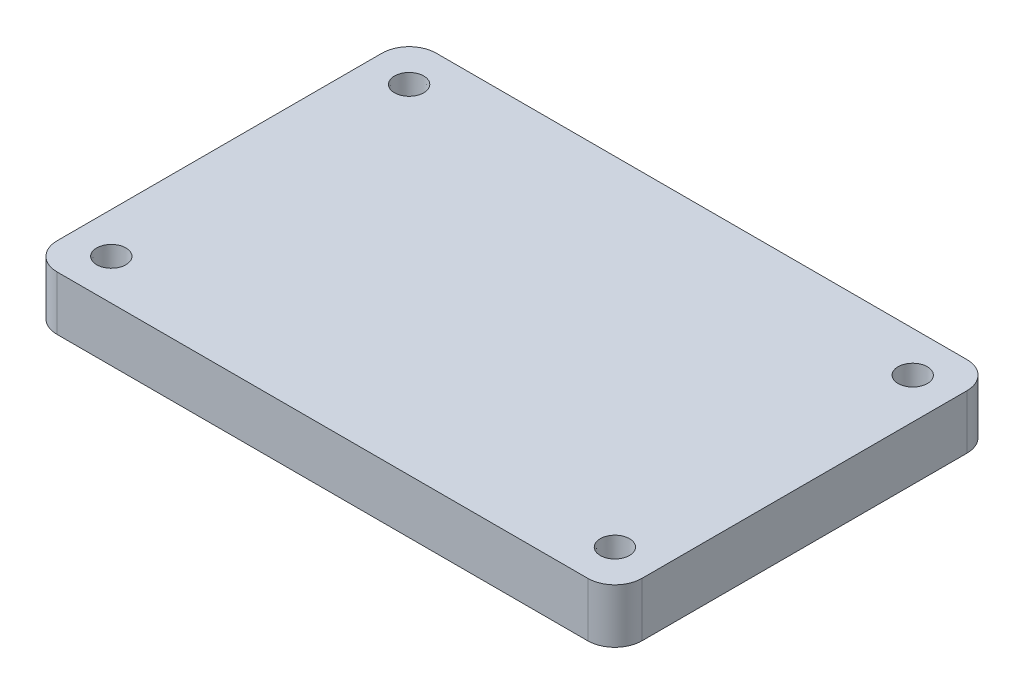
ISO-10303-21;
HEADER;
FILE_DESCRIPTION(('STEP AP214'),'2;1');
FILE_NAME('part.step','',(''),(''),'','','');
FILE_SCHEMA(('AUTOMOTIVE_DESIGN { 1 0 10303 214 1 1 1 1 }'));
ENDSEC;
DATA;
#1=APPLICATION_CONTEXT('core data for automotive mechanical design processes');
#2=APPLICATION_PROTOCOL_DEFINITION('international standard','automotive_design',2000,#1);
#3=PRODUCT_CONTEXT('',#1,'mechanical');
#4=PRODUCT('Part','Part','',(#3));
#5=PRODUCT_RELATED_PRODUCT_CATEGORY('part','',(#4));
#6=PRODUCT_DEFINITION_FORMATION('','',#4);
#7=PRODUCT_DEFINITION_CONTEXT('part definition',#1,'design');
#8=PRODUCT_DEFINITION('design','',#6,#7);
#9=PRODUCT_DEFINITION_SHAPE('','',#8);
#10=(LENGTH_UNIT() NAMED_UNIT(*) SI_UNIT(.MILLI.,.METRE.));
#11=(NAMED_UNIT(*) PLANE_ANGLE_UNIT() SI_UNIT($,.RADIAN.));
#12=(NAMED_UNIT(*) SI_UNIT($,.STERADIAN.) SOLID_ANGLE_UNIT());
#13=UNCERTAINTY_MEASURE_WITH_UNIT(LENGTH_MEASURE(1.E-05),#10,'distance_accuracy_value','');
#14=(GEOMETRIC_REPRESENTATION_CONTEXT(3) GLOBAL_UNCERTAINTY_ASSIGNED_CONTEXT((#13)) GLOBAL_UNIT_ASSIGNED_CONTEXT((#10,
#11,#12)) REPRESENTATION_CONTEXT('',''));
#15=CARTESIAN_POINT('',(0.,0.,0.));
#16=DIRECTION('',(0.,0.,1.));
#17=DIRECTION('',(1.,0.,0.));
#18=AXIS2_PLACEMENT_3D('',#15,#16,#17);
#19=CARTESIAN_POINT('',(54.,10.,35.));
#20=DIRECTION('',(-1.,0.,0.));
#21=DIRECTION('',(0.,0.,1.));
#22=AXIS2_PLACEMENT_3D('',#19,#20,#21);
#23=PLANE('',#22);
#24=DIRECTION('',(0.,0.,-1.));
#25=VECTOR('',#24,1.);
#26=CARTESIAN_POINT('',(54.,0.,35.));
#27=LINE('',#26,#25);
#28=CARTESIAN_POINT('',(54.,0.,30.));
#29=VERTEX_POINT('',#28);
#30=CARTESIAN_POINT('',(54.,0.,-30.));
#31=VERTEX_POINT('',#30);
#32=EDGE_CURVE('E189',#29,#31,#27,.T.);
#33=ORIENTED_EDGE('',*,*,#32,.T.);
#34=DIRECTION('',(0.,-1.,0.));
#35=VECTOR('',#34,1.);
#36=CARTESIAN_POINT('',(54.,10.,-30.));
#37=LINE('',#36,#35);
#38=CARTESIAN_POINT('',(54.,10.,-30.));
#39=VERTEX_POINT('',#38);
#40=EDGE_CURVE('E11',#31,#39,#37,.F.);
#41=ORIENTED_EDGE('',*,*,#40,.T.);
#42=DIRECTION('',(0.,0.,-1.));
#43=VECTOR('',#42,1.);
#44=CARTESIAN_POINT('',(54.,10.,35.));
#45=LINE('',#44,#43);
#46=CARTESIAN_POINT('',(54.,10.,30.));
#47=VERTEX_POINT('',#46);
#48=EDGE_CURVE('E142',#47,#39,#45,.T.);
#49=ORIENTED_EDGE('',*,*,#48,.F.);
#50=DIRECTION('',(0.,-1.,0.));
#51=VECTOR('',#50,1.);
#52=CARTESIAN_POINT('',(54.,10.,30.));
#53=LINE('',#52,#51);
#54=EDGE_CURVE('E55',#47,#29,#53,.T.);
#55=ORIENTED_EDGE('',*,*,#54,.T.);
#56=EDGE_LOOP('',(#33,#41,#49,#55));
#57=FACE_BOUND('',#56,.T.);
#58=ADVANCED_FACE('F45',(#57),#23,.F.);
#59=CARTESIAN_POINT('',(-54.,10.,-35.));
#60=DIRECTION('',(0.,0.,1.));
#61=DIRECTION('',(1.,0.,0.));
#62=AXIS2_PLACEMENT_3D('',#59,#60,#61);
#63=PLANE('',#62);
#64=DIRECTION('',(-1.,0.,0.));
#65=VECTOR('',#64,1.);
#66=CARTESIAN_POINT('',(-54.,0.,-35.));
#67=LINE('',#66,#65);
#68=CARTESIAN_POINT('',(49.,0.,-35.));
#69=VERTEX_POINT('',#68);
#70=CARTESIAN_POINT('',(-49.,0.,-35.));
#71=VERTEX_POINT('',#70);
#72=EDGE_CURVE('E149',#69,#71,#67,.T.);
#73=ORIENTED_EDGE('',*,*,#72,.T.);
#74=DIRECTION('',(0.,-1.,0.));
#75=VECTOR('',#74,1.);
#76=CARTESIAN_POINT('',(-49.,10.,-35.));
#77=LINE('',#76,#75);
#78=CARTESIAN_POINT('',(-49.,10.,-35.));
#79=VERTEX_POINT('',#78);
#80=EDGE_CURVE('E62',#71,#79,#77,.F.);
#81=ORIENTED_EDGE('',*,*,#80,.T.);
#82=DIRECTION('',(-1.,0.,0.));
#83=VECTOR('',#82,1.);
#84=CARTESIAN_POINT('',(-54.,10.,-35.));
#85=LINE('',#84,#83);
#86=CARTESIAN_POINT('',(49.,10.,-35.));
#87=VERTEX_POINT('',#86);
#88=EDGE_CURVE('E147',#87,#79,#85,.T.);
#89=ORIENTED_EDGE('',*,*,#88,.F.);
#90=DIRECTION('',(0.,-1.,0.));
#91=VECTOR('',#90,1.);
#92=CARTESIAN_POINT('',(49.,10.,-35.));
#93=LINE('',#92,#91);
#94=EDGE_CURVE('E178',#87,#69,#93,.T.);
#95=ORIENTED_EDGE('',*,*,#94,.T.);
#96=EDGE_LOOP('',(#73,#81,#89,#95));
#97=FACE_BOUND('',#96,.T.);
#98=ADVANCED_FACE('F370',(#97),#63,.F.);
#99=CARTESIAN_POINT('',(-54.,10.,35.));
#100=DIRECTION('',(1.,0.,0.));
#101=DIRECTION('',(0.,0.,-1.));
#102=AXIS2_PLACEMENT_3D('',#99,#100,#101);
#103=PLANE('',#102);
#104=DIRECTION('',(0.,0.,1.));
#105=VECTOR('',#104,1.);
#106=CARTESIAN_POINT('',(-54.,0.,35.));
#107=LINE('',#106,#105);
#108=CARTESIAN_POINT('',(-54.,0.,-30.));
#109=VERTEX_POINT('',#108);
#110=CARTESIAN_POINT('',(-54.,0.,30.));
#111=VERTEX_POINT('',#110);
#112=EDGE_CURVE('E143',#109,#111,#107,.T.);
#113=ORIENTED_EDGE('',*,*,#112,.T.);
#114=DIRECTION('',(0.,-1.,0.));
#115=VECTOR('',#114,1.);
#116=CARTESIAN_POINT('',(-54.,10.,30.));
#117=LINE('',#116,#115);
#118=CARTESIAN_POINT('',(-54.,10.,30.));
#119=VERTEX_POINT('',#118);
#120=EDGE_CURVE('E118',#111,#119,#117,.F.);
#121=ORIENTED_EDGE('',*,*,#120,.T.);
#122=DIRECTION('',(0.,0.,1.));
#123=VECTOR('',#122,1.);
#124=CARTESIAN_POINT('',(-54.,10.,35.));
#125=LINE('',#124,#123);
#126=CARTESIAN_POINT('',(-54.,10.,-30.));
#127=VERTEX_POINT('',#126);
#128=EDGE_CURVE('E205',#127,#119,#125,.T.);
#129=ORIENTED_EDGE('',*,*,#128,.F.);
#130=DIRECTION('',(0.,-1.,0.));
#131=VECTOR('',#130,1.);
#132=CARTESIAN_POINT('',(-54.,10.,-30.));
#133=LINE('',#132,#131);
#134=EDGE_CURVE('E124',#127,#109,#133,.T.);
#135=ORIENTED_EDGE('',*,*,#134,.T.);
#136=EDGE_LOOP('',(#113,#121,#129,#135));
#137=FACE_BOUND('',#136,.T.);
#138=ADVANCED_FACE('F375',(#137),#103,.F.);
#139=CARTESIAN_POINT('',(-54.,10.,35.));
#140=DIRECTION('',(0.,0.,-1.));
#141=DIRECTION('',(-1.,0.,0.));
#142=AXIS2_PLACEMENT_3D('',#139,#140,#141);
#143=PLANE('',#142);
#144=DIRECTION('',(1.,0.,0.));
#145=VECTOR('',#144,1.);
#146=CARTESIAN_POINT('',(-54.,10.,35.));
#147=LINE('',#146,#145);
#148=CARTESIAN_POINT('',(-49.,10.,35.));
#149=VERTEX_POINT('',#148);
#150=CARTESIAN_POINT('',(49.,10.,35.));
#151=VERTEX_POINT('',#150);
#152=EDGE_CURVE('E134',#149,#151,#147,.T.);
#153=ORIENTED_EDGE('',*,*,#152,.F.);
#154=DIRECTION('',(0.,-1.,0.));
#155=VECTOR('',#154,1.);
#156=CARTESIAN_POINT('',(-49.,10.,35.));
#157=LINE('',#156,#155);
#158=CARTESIAN_POINT('',(-49.,0.,35.));
#159=VERTEX_POINT('',#158);
#160=EDGE_CURVE('E117',#149,#159,#157,.T.);
#161=ORIENTED_EDGE('',*,*,#160,.T.);
#162=DIRECTION('',(1.,0.,0.));
#163=VECTOR('',#162,1.);
#164=CARTESIAN_POINT('',(-54.,0.,35.));
#165=LINE('',#164,#163);
#166=CARTESIAN_POINT('',(49.,0.,35.));
#167=VERTEX_POINT('',#166);
#168=EDGE_CURVE('E131',#159,#167,#165,.T.);
#169=ORIENTED_EDGE('',*,*,#168,.T.);
#170=DIRECTION('',(0.,-1.,0.));
#171=VECTOR('',#170,1.);
#172=CARTESIAN_POINT('',(49.,10.,35.));
#173=LINE('',#172,#171);
#174=EDGE_CURVE('E137',#167,#151,#173,.F.);
#175=ORIENTED_EDGE('',*,*,#174,.T.);
#176=EDGE_LOOP('',(#153,#161,#169,#175));
#177=FACE_BOUND('',#176,.T.);
#178=ADVANCED_FACE('F130',(#177),#143,.F.);
#179=CARTESIAN_POINT('',(0.,10.,0.));
#180=DIRECTION('',(0.,-1.,0.));
#181=DIRECTION('',(0.,0.,-1.));
#182=AXIS2_PLACEMENT_3D('',#179,#180,#181);
#183=PLANE('',#182);
#184=CARTESIAN_POINT('',(46.5,10.,-27.5));
#185=DIRECTION('',(0.,1.,0.));
#186=DIRECTION('',(0.,0.,1.));
#187=AXIS2_PLACEMENT_3D('',#184,#185,#186);
#188=CIRCLE('',#187,2.70000000000001);
#189=CARTESIAN_POINT('',(46.5,10.,-24.8));
#190=VERTEX_POINT('',#189);
#191=EDGE_CURVE('E250',#190,#190,#188,.T.);
#192=ORIENTED_EDGE('',*,*,#191,.F.);
#193=EDGE_LOOP('',(#192));
#194=FACE_BOUND('',#193,.T.);
#195=CARTESIAN_POINT('',(-46.5,10.,-27.5));
#196=DIRECTION('',(0.,1.,0.));
#197=DIRECTION('',(0.,0.,1.));
#198=AXIS2_PLACEMENT_3D('',#195,#196,#197);
#199=CIRCLE('',#198,2.70000000000001);
#200=CARTESIAN_POINT('',(-46.5,10.,-24.8));
#201=VERTEX_POINT('',#200);
#202=EDGE_CURVE('E238',#201,#201,#199,.T.);
#203=ORIENTED_EDGE('',*,*,#202,.F.);
#204=EDGE_LOOP('',(#203));
#205=FACE_BOUND('',#204,.T.);
#206=CARTESIAN_POINT('',(-46.5,10.,27.5));
#207=DIRECTION('',(0.,1.,0.));
#208=DIRECTION('',(0.,0.,1.));
#209=AXIS2_PLACEMENT_3D('',#206,#207,#208);
#210=CIRCLE('',#209,2.70000000000001);
#211=CARTESIAN_POINT('',(-46.5,10.,30.2));
#212=VERTEX_POINT('',#211);
#213=EDGE_CURVE('E226',#212,#212,#210,.T.);
#214=ORIENTED_EDGE('',*,*,#213,.F.);
#215=EDGE_LOOP('',(#214));
#216=FACE_BOUND('',#215,.T.);
#217=CARTESIAN_POINT('',(46.5,10.,27.5));
#218=DIRECTION('',(0.,1.,0.));
#219=DIRECTION('',(0.,0.,1.));
#220=AXIS2_PLACEMENT_3D('',#217,#218,#219);
#221=CIRCLE('',#220,2.70000000000001);
#222=CARTESIAN_POINT('',(46.5,10.,30.2));
#223=VERTEX_POINT('',#222);
#224=EDGE_CURVE('E214',#223,#223,#221,.T.);
#225=ORIENTED_EDGE('',*,*,#224,.F.);
#226=EDGE_LOOP('',(#225));
#227=FACE_BOUND('',#226,.T.);
#228=ORIENTED_EDGE('',*,*,#128,.T.);
#229=CARTESIAN_POINT('',(-49.,10.,30.));
#230=DIRECTION('',(0.,-1.,0.));
#231=DIRECTION('',(0.,0.,-1.));
#232=AXIS2_PLACEMENT_3D('',#229,#230,#231);
#233=CIRCLE('',#232,5.);
#234=EDGE_CURVE('E175',#119,#149,#233,.F.);
#235=ORIENTED_EDGE('',*,*,#234,.T.);
#236=ORIENTED_EDGE('',*,*,#152,.T.);
#237=CARTESIAN_POINT('',(49.,10.,30.));
#238=DIRECTION('',(0.,-1.,0.));
#239=DIRECTION('',(0.,0.,-1.));
#240=AXIS2_PLACEMENT_3D('',#237,#238,#239);
#241=CIRCLE('',#240,5.);
#242=EDGE_CURVE('E167',#151,#47,#241,.F.);
#243=ORIENTED_EDGE('',*,*,#242,.T.);
#244=ORIENTED_EDGE('',*,*,#48,.T.);
#245=CARTESIAN_POINT('',(49.,10.,-30.));
#246=DIRECTION('',(0.,-1.,0.));
#247=DIRECTION('',(0.,0.,-1.));
#248=AXIS2_PLACEMENT_3D('',#245,#246,#247);
#249=CIRCLE('',#248,5.);
#250=EDGE_CURVE('E69',#39,#87,#249,.F.);
#251=ORIENTED_EDGE('',*,*,#250,.T.);
#252=ORIENTED_EDGE('',*,*,#88,.T.);
#253=CARTESIAN_POINT('',(-49.,10.,-30.));
#254=DIRECTION('',(0.,-1.,0.));
#255=DIRECTION('',(0.,0.,-1.));
#256=AXIS2_PLACEMENT_3D('',#253,#254,#255);
#257=CIRCLE('',#256,5.);
#258=EDGE_CURVE('E172',#79,#127,#257,.F.);
#259=ORIENTED_EDGE('',*,*,#258,.T.);
#260=EDGE_LOOP('',(#228,#235,#236,#243,#244,#251,#252,#259));
#261=FACE_BOUND('',#260,.T.);
#262=ADVANCED_FACE('F333',(#194,#205,#216,#227,#261),#183,.F.);
#263=CARTESIAN_POINT('',(0.,0.,0.));
#264=DIRECTION('',(0.,-1.,0.));
#265=DIRECTION('',(0.,0.,-1.));
#266=AXIS2_PLACEMENT_3D('',#263,#264,#265);
#267=PLANE('',#266);
#268=CARTESIAN_POINT('',(20.3,0.,0.));
#269=DIRECTION('',(0.,-1.,0.));
#270=DIRECTION('',(0.,0.,-1.));
#271=AXIS2_PLACEMENT_3D('',#268,#269,#270);
#272=CIRCLE('',#271,2.70000000000001);
#273=CARTESIAN_POINT('',(20.3,0.,-2.70000000000001));
#274=VERTEX_POINT('',#273);
#275=EDGE_CURVE('E322',#274,#274,#272,.T.);
#276=ORIENTED_EDGE('',*,*,#275,.F.);
#277=EDGE_LOOP('',(#276));
#278=FACE_BOUND('',#277,.T.);
#279=CARTESIAN_POINT('',(-20.3,0.,0.));
#280=DIRECTION('',(0.,-1.,0.));
#281=DIRECTION('',(0.,0.,-1.));
#282=AXIS2_PLACEMENT_3D('',#279,#280,#281);
#283=CIRCLE('',#282,2.70000000000001);
#284=CARTESIAN_POINT('',(-20.3,0.,-2.70000000000001));
#285=VERTEX_POINT('',#284);
#286=EDGE_CURVE('E310',#285,#285,#283,.T.);
#287=ORIENTED_EDGE('',*,*,#286,.F.);
#288=EDGE_LOOP('',(#287));
#289=FACE_BOUND('',#288,.T.);
#290=CARTESIAN_POINT('',(30.,0.,-27.5));
#291=DIRECTION('',(0.,-1.,0.));
#292=DIRECTION('',(0.,0.,-1.));
#293=AXIS2_PLACEMENT_3D('',#290,#291,#292);
#294=CIRCLE('',#293,2.70000000000001);
#295=CARTESIAN_POINT('',(30.,0.,-30.2));
#296=VERTEX_POINT('',#295);
#297=EDGE_CURVE('E298',#296,#296,#294,.T.);
#298=ORIENTED_EDGE('',*,*,#297,.F.);
#299=EDGE_LOOP('',(#298));
#300=FACE_BOUND('',#299,.T.);
#301=CARTESIAN_POINT('',(-30.,0.,-27.5));
#302=DIRECTION('',(0.,-1.,0.));
#303=DIRECTION('',(0.,0.,-1.));
#304=AXIS2_PLACEMENT_3D('',#301,#302,#303);
#305=CIRCLE('',#304,2.70000000000001);
#306=CARTESIAN_POINT('',(-30.,0.,-30.2));
#307=VERTEX_POINT('',#306);
#308=EDGE_CURVE('E286',#307,#307,#305,.T.);
#309=ORIENTED_EDGE('',*,*,#308,.F.);
#310=EDGE_LOOP('',(#309));
#311=FACE_BOUND('',#310,.T.);
#312=CARTESIAN_POINT('',(-30.,0.,27.5));
#313=DIRECTION('',(0.,-1.,0.));
#314=DIRECTION('',(0.,0.,-1.));
#315=AXIS2_PLACEMENT_3D('',#312,#313,#314);
#316=CIRCLE('',#315,2.70000000000001);
#317=CARTESIAN_POINT('',(-30.,0.,24.8));
#318=VERTEX_POINT('',#317);
#319=EDGE_CURVE('E274',#318,#318,#316,.T.);
#320=ORIENTED_EDGE('',*,*,#319,.F.);
#321=EDGE_LOOP('',(#320));
#322=FACE_BOUND('',#321,.T.);
#323=CARTESIAN_POINT('',(30.,0.,27.5));
#324=DIRECTION('',(0.,-1.,0.));
#325=DIRECTION('',(0.,0.,-1.));
#326=AXIS2_PLACEMENT_3D('',#323,#324,#325);
#327=CIRCLE('',#326,2.70000000000001);
#328=CARTESIAN_POINT('',(30.,0.,24.8));
#329=VERTEX_POINT('',#328);
#330=EDGE_CURVE('E262',#329,#329,#327,.T.);
#331=ORIENTED_EDGE('',*,*,#330,.F.);
#332=EDGE_LOOP('',(#331));
#333=FACE_BOUND('',#332,.T.);
#334=ORIENTED_EDGE('',*,*,#168,.F.);
#335=CARTESIAN_POINT('',(-49.,0.,30.));
#336=DIRECTION('',(0.,-1.,0.));
#337=DIRECTION('',(0.,0.,-1.));
#338=AXIS2_PLACEMENT_3D('',#335,#336,#337);
#339=CIRCLE('',#338,5.);
#340=EDGE_CURVE('E113',#159,#111,#339,.T.);
#341=ORIENTED_EDGE('',*,*,#340,.T.);
#342=ORIENTED_EDGE('',*,*,#112,.F.);
#343=CARTESIAN_POINT('',(-49.,0.,-30.));
#344=DIRECTION('',(0.,-1.,0.));
#345=DIRECTION('',(0.,0.,-1.));
#346=AXIS2_PLACEMENT_3D('',#343,#344,#345);
#347=CIRCLE('',#346,5.);
#348=EDGE_CURVE('E125',#109,#71,#347,.T.);
#349=ORIENTED_EDGE('',*,*,#348,.T.);
#350=ORIENTED_EDGE('',*,*,#72,.F.);
#351=CARTESIAN_POINT('',(49.,0.,-30.));
#352=DIRECTION('',(0.,-1.,0.));
#353=DIRECTION('',(0.,0.,-1.));
#354=AXIS2_PLACEMENT_3D('',#351,#352,#353);
#355=CIRCLE('',#354,5.);
#356=EDGE_CURVE('E157',#69,#31,#355,.T.);
#357=ORIENTED_EDGE('',*,*,#356,.T.);
#358=ORIENTED_EDGE('',*,*,#32,.F.);
#359=CARTESIAN_POINT('',(49.,0.,30.));
#360=DIRECTION('',(0.,-1.,0.));
#361=DIRECTION('',(0.,0.,-1.));
#362=AXIS2_PLACEMENT_3D('',#359,#360,#361);
#363=CIRCLE('',#362,5.);
#364=EDGE_CURVE('E136',#29,#167,#363,.T.);
#365=ORIENTED_EDGE('',*,*,#364,.T.);
#366=EDGE_LOOP('',(#334,#341,#342,#349,#350,#357,#358,#365));
#367=FACE_BOUND('',#366,.T.);
#368=ADVANCED_FACE('F139',(#278,#289,#300,#311,#322,#333,#367),#267,.T.);
#369=CARTESIAN_POINT('',(46.5,1.99999999999999,27.5));
#370=DIRECTION('',(0.,-1.,0.));
#371=DIRECTION('',(0.,0.,-1.));
#372=AXIS2_PLACEMENT_3D('',#369,#370,#371);
#373=PLANE('',#372);
#374=CARTESIAN_POINT('',(46.5,1.99999999999999,27.5));
#375=DIRECTION('',(0.,1.,0.));
#376=DIRECTION('',(0.,0.,1.));
#377=AXIS2_PLACEMENT_3D('',#374,#375,#376);
#378=CIRCLE('',#377,2.40000000000001);
#379=CARTESIAN_POINT('',(46.5,1.99999999999999,29.9));
#380=VERTEX_POINT('',#379);
#381=EDGE_CURVE('E195',#380,#380,#378,.T.);
#382=ORIENTED_EDGE('',*,*,#381,.T.);
#383=EDGE_LOOP('',(#382));
#384=FACE_BOUND('',#383,.T.);
#385=ADVANCED_FACE('F332',(#384),#373,.F.);
#386=CARTESIAN_POINT('',(46.5,10.,27.5));
#387=DIRECTION('',(0.,1.,0.));
#388=DIRECTION('',(0.,0.,1.));
#389=AXIS2_PLACEMENT_3D('',#386,#387,#388);
#390=CYLINDRICAL_SURFACE('',#389,2.40000000000001);
#391=ORIENTED_EDGE('',*,*,#381,.F.);
#392=EDGE_LOOP('',(#391));
#393=FACE_BOUND('',#392,.T.);
#394=CARTESIAN_POINT('',(46.5,4.,27.5));
#395=DIRECTION('',(0.,1.,0.));
#396=DIRECTION('',(0.,0.,1.));
#397=AXIS2_PLACEMENT_3D('',#394,#395,#396);
#398=CIRCLE('',#397,2.40000000000001);
#399=CARTESIAN_POINT('',(46.5,4.,29.9));
#400=VERTEX_POINT('',#399);
#401=EDGE_CURVE('E200',#400,#400,#398,.T.);
#402=ORIENTED_EDGE('',*,*,#401,.T.);
#403=EDGE_LOOP('',(#402));
#404=FACE_BOUND('',#403,.T.);
#405=ADVANCED_FACE('F740',(#393,#404),#390,.F.);
#406=CARTESIAN_POINT('',(-46.5,1.99999999999999,27.5));
#407=DIRECTION('',(0.,-1.,0.));
#408=DIRECTION('',(0.,0.,-1.));
#409=AXIS2_PLACEMENT_3D('',#406,#407,#408);
#410=PLANE('',#409);
#411=CARTESIAN_POINT('',(-46.5,1.99999999999999,27.5));
#412=DIRECTION('',(0.,1.,0.));
#413=DIRECTION('',(0.,0.,1.));
#414=AXIS2_PLACEMENT_3D('',#411,#412,#413);
#415=CIRCLE('',#414,2.40000000000001);
#416=CARTESIAN_POINT('',(-46.5,1.99999999999999,29.9));
#417=VERTEX_POINT('',#416);
#418=EDGE_CURVE('E218',#417,#417,#415,.T.);
#419=ORIENTED_EDGE('',*,*,#418,.T.);
#420=EDGE_LOOP('',(#419));
#421=FACE_BOUND('',#420,.T.);
#422=ADVANCED_FACE('F730',(#421),#410,.F.);
#423=CARTESIAN_POINT('',(-46.5,10.,27.5));
#424=DIRECTION('',(0.,1.,0.));
#425=DIRECTION('',(0.,0.,1.));
#426=AXIS2_PLACEMENT_3D('',#423,#424,#425);
#427=CYLINDRICAL_SURFACE('',#426,2.40000000000001);
#428=ORIENTED_EDGE('',*,*,#418,.F.);
#429=EDGE_LOOP('',(#428));
#430=FACE_BOUND('',#429,.T.);
#431=CARTESIAN_POINT('',(-46.5,4.,27.5));
#432=DIRECTION('',(0.,1.,0.));
#433=DIRECTION('',(0.,0.,1.));
#434=AXIS2_PLACEMENT_3D('',#431,#432,#433);
#435=CIRCLE('',#434,2.40000000000001);
#436=CARTESIAN_POINT('',(-46.5,4.,29.9));
#437=VERTEX_POINT('',#436);
#438=EDGE_CURVE('E222',#437,#437,#435,.T.);
#439=ORIENTED_EDGE('',*,*,#438,.T.);
#440=EDGE_LOOP('',(#439));
#441=FACE_BOUND('',#440,.T.);
#442=ADVANCED_FACE('F720',(#430,#441),#427,.F.);
#443=CARTESIAN_POINT('',(-46.5,1.99999999999999,-27.5));
#444=DIRECTION('',(0.,-1.,0.));
#445=DIRECTION('',(0.,0.,-1.));
#446=AXIS2_PLACEMENT_3D('',#443,#444,#445);
#447=PLANE('',#446);
#448=CARTESIAN_POINT('',(-46.5,1.99999999999999,-27.5));
#449=DIRECTION('',(0.,1.,0.));
#450=DIRECTION('',(0.,0.,1.));
#451=AXIS2_PLACEMENT_3D('',#448,#449,#450);
#452=CIRCLE('',#451,2.40000000000001);
#453=CARTESIAN_POINT('',(-46.5,1.99999999999999,-25.1));
#454=VERTEX_POINT('',#453);
#455=EDGE_CURVE('E230',#454,#454,#452,.T.);
#456=ORIENTED_EDGE('',*,*,#455,.T.);
#457=EDGE_LOOP('',(#456));
#458=FACE_BOUND('',#457,.T.);
#459=ADVANCED_FACE('F710',(#458),#447,.F.);
#460=CARTESIAN_POINT('',(-46.5,10.,-27.5));
#461=DIRECTION('',(0.,1.,0.));
#462=DIRECTION('',(0.,0.,1.));
#463=AXIS2_PLACEMENT_3D('',#460,#461,#462);
#464=CYLINDRICAL_SURFACE('',#463,2.40000000000001);
#465=ORIENTED_EDGE('',*,*,#455,.F.);
#466=EDGE_LOOP('',(#465));
#467=FACE_BOUND('',#466,.T.);
#468=CARTESIAN_POINT('',(-46.5,4.,-27.5));
#469=DIRECTION('',(0.,1.,0.));
#470=DIRECTION('',(0.,0.,1.));
#471=AXIS2_PLACEMENT_3D('',#468,#469,#470);
#472=CIRCLE('',#471,2.40000000000001);
#473=CARTESIAN_POINT('',(-46.5,4.,-25.1));
#474=VERTEX_POINT('',#473);
#475=EDGE_CURVE('E234',#474,#474,#472,.T.);
#476=ORIENTED_EDGE('',*,*,#475,.T.);
#477=EDGE_LOOP('',(#476));
#478=FACE_BOUND('',#477,.T.);
#479=ADVANCED_FACE('F700',(#467,#478),#464,.F.);
#480=CARTESIAN_POINT('',(46.5,1.99999999999999,-27.5));
#481=DIRECTION('',(0.,-1.,0.));
#482=DIRECTION('',(0.,0.,-1.));
#483=AXIS2_PLACEMENT_3D('',#480,#481,#482);
#484=PLANE('',#483);
#485=CARTESIAN_POINT('',(46.5,1.99999999999999,-27.5));
#486=DIRECTION('',(0.,1.,0.));
#487=DIRECTION('',(0.,0.,1.));
#488=AXIS2_PLACEMENT_3D('',#485,#486,#487);
#489=CIRCLE('',#488,2.40000000000001);
#490=CARTESIAN_POINT('',(46.5,1.99999999999999,-25.1));
#491=VERTEX_POINT('',#490);
#492=EDGE_CURVE('E242',#491,#491,#489,.T.);
#493=ORIENTED_EDGE('',*,*,#492,.T.);
#494=EDGE_LOOP('',(#493));
#495=FACE_BOUND('',#494,.T.);
#496=ADVANCED_FACE('F690',(#495),#484,.F.);
#497=CARTESIAN_POINT('',(46.5,10.,-27.5));
#498=DIRECTION('',(0.,1.,0.));
#499=DIRECTION('',(0.,0.,1.));
#500=AXIS2_PLACEMENT_3D('',#497,#498,#499);
#501=CYLINDRICAL_SURFACE('',#500,2.40000000000001);
#502=ORIENTED_EDGE('',*,*,#492,.F.);
#503=EDGE_LOOP('',(#502));
#504=FACE_BOUND('',#503,.T.);
#505=CARTESIAN_POINT('',(46.5,4.,-27.5));
#506=DIRECTION('',(0.,1.,0.));
#507=DIRECTION('',(0.,0.,1.));
#508=AXIS2_PLACEMENT_3D('',#505,#506,#507);
#509=CIRCLE('',#508,2.40000000000001);
#510=CARTESIAN_POINT('',(46.5,4.,-25.1));
#511=VERTEX_POINT('',#510);
#512=EDGE_CURVE('E246',#511,#511,#509,.T.);
#513=ORIENTED_EDGE('',*,*,#512,.T.);
#514=EDGE_LOOP('',(#513));
#515=FACE_BOUND('',#514,.T.);
#516=ADVANCED_FACE('F382',(#504,#515),#501,.F.);
#517=CARTESIAN_POINT('',(-49.,10.,30.));
#518=DIRECTION('',(0.,-1.,0.));
#519=DIRECTION('',(0.,0.,-1.));
#520=AXIS2_PLACEMENT_3D('',#517,#518,#519);
#521=CYLINDRICAL_SURFACE('',#520,5.);
#522=ORIENTED_EDGE('',*,*,#234,.F.);
#523=ORIENTED_EDGE('',*,*,#120,.F.);
#524=ORIENTED_EDGE('',*,*,#340,.F.);
#525=ORIENTED_EDGE('',*,*,#160,.F.);
#526=EDGE_LOOP('',(#522,#523,#524,#525));
#527=FACE_BOUND('',#526,.T.);
#528=ADVANCED_FACE('F116',(#527),#521,.T.);
#529=CARTESIAN_POINT('',(-49.,10.,-30.));
#530=DIRECTION('',(0.,-1.,0.));
#531=DIRECTION('',(0.,0.,-1.));
#532=AXIS2_PLACEMENT_3D('',#529,#530,#531);
#533=CYLINDRICAL_SURFACE('',#532,5.);
#534=ORIENTED_EDGE('',*,*,#258,.F.);
#535=ORIENTED_EDGE('',*,*,#80,.F.);
#536=ORIENTED_EDGE('',*,*,#348,.F.);
#537=ORIENTED_EDGE('',*,*,#134,.F.);
#538=EDGE_LOOP('',(#534,#535,#536,#537));
#539=FACE_BOUND('',#538,.T.);
#540=ADVANCED_FACE('F381',(#539),#533,.T.);
#541=CARTESIAN_POINT('',(49.,10.,-30.));
#542=DIRECTION('',(0.,-1.,0.));
#543=DIRECTION('',(0.,0.,-1.));
#544=AXIS2_PLACEMENT_3D('',#541,#542,#543);
#545=CYLINDRICAL_SURFACE('',#544,5.);
#546=ORIENTED_EDGE('',*,*,#250,.F.);
#547=ORIENTED_EDGE('',*,*,#40,.F.);
#548=ORIENTED_EDGE('',*,*,#356,.F.);
#549=ORIENTED_EDGE('',*,*,#94,.F.);
#550=EDGE_LOOP('',(#546,#547,#548,#549));
#551=FACE_BOUND('',#550,.T.);
#552=ADVANCED_FACE('F385',(#551),#545,.T.);
#553=CARTESIAN_POINT('',(49.,10.,30.));
#554=DIRECTION('',(0.,-1.,0.));
#555=DIRECTION('',(0.,0.,-1.));
#556=AXIS2_PLACEMENT_3D('',#553,#554,#555);
#557=CYLINDRICAL_SURFACE('',#556,5.);
#558=ORIENTED_EDGE('',*,*,#242,.F.);
#559=ORIENTED_EDGE('',*,*,#174,.F.);
#560=ORIENTED_EDGE('',*,*,#364,.F.);
#561=ORIENTED_EDGE('',*,*,#54,.F.);
#562=EDGE_LOOP('',(#558,#559,#560,#561));
#563=FACE_BOUND('',#562,.T.);
#564=ADVANCED_FACE('F365',(#563),#557,.T.);
#565=CARTESIAN_POINT('',(30.,8.00000000000001,27.5));
#566=DIRECTION('',(0.,1.,0.));
#567=DIRECTION('',(0.,0.,1.));
#568=AXIS2_PLACEMENT_3D('',#565,#566,#567);
#569=PLANE('',#568);
#570=CARTESIAN_POINT('',(30.,8.00000000000001,27.5));
#571=DIRECTION('',(0.,-1.,0.));
#572=DIRECTION('',(0.,0.,-1.));
#573=AXIS2_PLACEMENT_3D('',#570,#571,#572);
#574=CIRCLE('',#573,2.40000000000001);
#575=CARTESIAN_POINT('',(30.,8.00000000000001,25.1));
#576=VERTEX_POINT('',#575);
#577=EDGE_CURVE('E254',#576,#576,#574,.T.);
#578=ORIENTED_EDGE('',*,*,#577,.T.);
#579=EDGE_LOOP('',(#578));
#580=FACE_BOUND('',#579,.T.);
#581=ADVANCED_FACE('F355',(#580),#569,.F.);
#582=CARTESIAN_POINT('',(30.,0.,27.5));
#583=DIRECTION('',(0.,-1.,0.));
#584=DIRECTION('',(0.,0.,-1.));
#585=AXIS2_PLACEMENT_3D('',#582,#583,#584);
#586=CYLINDRICAL_SURFACE('',#585,2.40000000000001);
#587=ORIENTED_EDGE('',*,*,#577,.F.);
#588=EDGE_LOOP('',(#587));
#589=FACE_BOUND('',#588,.T.);
#590=CARTESIAN_POINT('',(30.,6.,27.5));
#591=DIRECTION('',(0.,-1.,0.));
#592=DIRECTION('',(0.,0.,-1.));
#593=AXIS2_PLACEMENT_3D('',#590,#591,#592);
#594=CIRCLE('',#593,2.40000000000001);
#595=CARTESIAN_POINT('',(30.,6.,25.1));
#596=VERTEX_POINT('',#595);
#597=EDGE_CURVE('E258',#596,#596,#594,.T.);
#598=ORIENTED_EDGE('',*,*,#597,.T.);
#599=EDGE_LOOP('',(#598));
#600=FACE_BOUND('',#599,.T.);
#601=ADVANCED_FACE('F352',(#589,#600),#586,.F.);
#602=CARTESIAN_POINT('',(-30.,8.00000000000001,27.5));
#603=DIRECTION('',(0.,1.,0.));
#604=DIRECTION('',(0.,0.,1.));
#605=AXIS2_PLACEMENT_3D('',#602,#603,#604);
#606=PLANE('',#605);
#607=CARTESIAN_POINT('',(-30.,8.00000000000001,27.5));
#608=DIRECTION('',(0.,-1.,0.));
#609=DIRECTION('',(0.,0.,-1.));
#610=AXIS2_PLACEMENT_3D('',#607,#608,#609);
#611=CIRCLE('',#610,2.40000000000001);
#612=CARTESIAN_POINT('',(-30.,8.00000000000001,25.1));
#613=VERTEX_POINT('',#612);
#614=EDGE_CURVE('E266',#613,#613,#611,.T.);
#615=ORIENTED_EDGE('',*,*,#614,.T.);
#616=EDGE_LOOP('',(#615));
#617=FACE_BOUND('',#616,.T.);
#618=ADVANCED_FACE('F354',(#617),#606,.F.);
#619=CARTESIAN_POINT('',(-30.,0.,27.5));
#620=DIRECTION('',(0.,-1.,0.));
#621=DIRECTION('',(0.,0.,-1.));
#622=AXIS2_PLACEMENT_3D('',#619,#620,#621);
#623=CYLINDRICAL_SURFACE('',#622,2.40000000000001);
#624=ORIENTED_EDGE('',*,*,#614,.F.);
#625=EDGE_LOOP('',(#624));
#626=FACE_BOUND('',#625,.T.);
#627=CARTESIAN_POINT('',(-30.,6.,27.5));
#628=DIRECTION('',(0.,-1.,0.));
#629=DIRECTION('',(0.,0.,-1.));
#630=AXIS2_PLACEMENT_3D('',#627,#628,#629);
#631=CIRCLE('',#630,2.40000000000001);
#632=CARTESIAN_POINT('',(-30.,6.,25.1));
#633=VERTEX_POINT('',#632);
#634=EDGE_CURVE('E270',#633,#633,#631,.T.);
#635=ORIENTED_EDGE('',*,*,#634,.T.);
#636=EDGE_LOOP('',(#635));
#637=FACE_BOUND('',#636,.T.);
#638=ADVANCED_FACE('F362',(#626,#637),#623,.F.);
#639=CARTESIAN_POINT('',(-30.,8.00000000000001,-27.5));
#640=DIRECTION('',(0.,1.,0.));
#641=DIRECTION('',(0.,0.,1.));
#642=AXIS2_PLACEMENT_3D('',#639,#640,#641);
#643=PLANE('',#642);
#644=CARTESIAN_POINT('',(-30.,8.00000000000001,-27.5));
#645=DIRECTION('',(0.,-1.,0.));
#646=DIRECTION('',(0.,0.,-1.));
#647=AXIS2_PLACEMENT_3D('',#644,#645,#646);
#648=CIRCLE('',#647,2.40000000000001);
#649=CARTESIAN_POINT('',(-30.,8.00000000000001,-29.9));
#650=VERTEX_POINT('',#649);
#651=EDGE_CURVE('E278',#650,#650,#648,.T.);
#652=ORIENTED_EDGE('',*,*,#651,.T.);
#653=EDGE_LOOP('',(#652));
#654=FACE_BOUND('',#653,.T.);
#655=ADVANCED_FACE('F457',(#654),#643,.F.);
#656=CARTESIAN_POINT('',(-30.,0.,-27.5));
#657=DIRECTION('',(0.,-1.,0.));
#658=DIRECTION('',(0.,0.,-1.));
#659=AXIS2_PLACEMENT_3D('',#656,#657,#658);
#660=CYLINDRICAL_SURFACE('',#659,2.40000000000001);
#661=ORIENTED_EDGE('',*,*,#651,.F.);
#662=EDGE_LOOP('',(#661));
#663=FACE_BOUND('',#662,.T.);
#664=CARTESIAN_POINT('',(-30.,6.,-27.5));
#665=DIRECTION('',(0.,-1.,0.));
#666=DIRECTION('',(0.,0.,-1.));
#667=AXIS2_PLACEMENT_3D('',#664,#665,#666);
#668=CIRCLE('',#667,2.40000000000001);
#669=CARTESIAN_POINT('',(-30.,6.,-29.9));
#670=VERTEX_POINT('',#669);
#671=EDGE_CURVE('E282',#670,#670,#668,.T.);
#672=ORIENTED_EDGE('',*,*,#671,.T.);
#673=EDGE_LOOP('',(#672));
#674=FACE_BOUND('',#673,.T.);
#675=ADVANCED_FACE('F454',(#663,#674),#660,.F.);
#676=CARTESIAN_POINT('',(30.,8.00000000000001,-27.5));
#677=DIRECTION('',(0.,1.,0.));
#678=DIRECTION('',(0.,0.,1.));
#679=AXIS2_PLACEMENT_3D('',#676,#677,#678);
#680=PLANE('',#679);
#681=CARTESIAN_POINT('',(30.,8.00000000000001,-27.5));
#682=DIRECTION('',(0.,-1.,0.));
#683=DIRECTION('',(0.,0.,-1.));
#684=AXIS2_PLACEMENT_3D('',#681,#682,#683);
#685=CIRCLE('',#684,2.40000000000001);
#686=CARTESIAN_POINT('',(30.,8.00000000000001,-29.9));
#687=VERTEX_POINT('',#686);
#688=EDGE_CURVE('E290',#687,#687,#685,.T.);
#689=ORIENTED_EDGE('',*,*,#688,.T.);
#690=EDGE_LOOP('',(#689));
#691=FACE_BOUND('',#690,.T.);
#692=ADVANCED_FACE('F456',(#691),#680,.F.);
#693=CARTESIAN_POINT('',(30.,0.,-27.5));
#694=DIRECTION('',(0.,-1.,0.));
#695=DIRECTION('',(0.,0.,-1.));
#696=AXIS2_PLACEMENT_3D('',#693,#694,#695);
#697=CYLINDRICAL_SURFACE('',#696,2.40000000000001);
#698=ORIENTED_EDGE('',*,*,#688,.F.);
#699=EDGE_LOOP('',(#698));
#700=FACE_BOUND('',#699,.T.);
#701=CARTESIAN_POINT('',(30.,6.,-27.5));
#702=DIRECTION('',(0.,-1.,0.));
#703=DIRECTION('',(0.,0.,-1.));
#704=AXIS2_PLACEMENT_3D('',#701,#702,#703);
#705=CIRCLE('',#704,2.40000000000001);
#706=CARTESIAN_POINT('',(30.,6.,-29.9));
#707=VERTEX_POINT('',#706);
#708=EDGE_CURVE('E294',#707,#707,#705,.T.);
#709=ORIENTED_EDGE('',*,*,#708,.T.);
#710=EDGE_LOOP('',(#709));
#711=FACE_BOUND('',#710,.T.);
#712=ADVANCED_FACE('F464',(#700,#711),#697,.F.);
#713=CARTESIAN_POINT('',(-20.3,8.00000000000001,0.));
#714=DIRECTION('',(0.,1.,0.));
#715=DIRECTION('',(0.,0.,1.));
#716=AXIS2_PLACEMENT_3D('',#713,#714,#715);
#717=PLANE('',#716);
#718=CARTESIAN_POINT('',(-20.3,8.00000000000001,0.));
#719=DIRECTION('',(0.,-1.,0.));
#720=DIRECTION('',(0.,0.,-1.));
#721=AXIS2_PLACEMENT_3D('',#718,#719,#720);
#722=CIRCLE('',#721,2.40000000000001);
#723=CARTESIAN_POINT('',(-20.3,8.00000000000001,-2.40000000000001));
#724=VERTEX_POINT('',#723);
#725=EDGE_CURVE('E302',#724,#724,#722,.T.);
#726=ORIENTED_EDGE('',*,*,#725,.T.);
#727=EDGE_LOOP('',(#726));
#728=FACE_BOUND('',#727,.T.);
#729=ADVANCED_FACE('F508',(#728),#717,.F.);
#730=CARTESIAN_POINT('',(-20.3,0.,0.));
#731=DIRECTION('',(0.,-1.,0.));
#732=DIRECTION('',(0.,0.,-1.));
#733=AXIS2_PLACEMENT_3D('',#730,#731,#732);
#734=CYLINDRICAL_SURFACE('',#733,2.40000000000001);
#735=ORIENTED_EDGE('',*,*,#725,.F.);
#736=EDGE_LOOP('',(#735));
#737=FACE_BOUND('',#736,.T.);
#738=CARTESIAN_POINT('',(-20.3,6.,0.));
#739=DIRECTION('',(0.,-1.,0.));
#740=DIRECTION('',(0.,0.,-1.));
#741=AXIS2_PLACEMENT_3D('',#738,#739,#740);
#742=CIRCLE('',#741,2.40000000000001);
#743=CARTESIAN_POINT('',(-20.3,6.,-2.40000000000001));
#744=VERTEX_POINT('',#743);
#745=EDGE_CURVE('E306',#744,#744,#742,.T.);
#746=ORIENTED_EDGE('',*,*,#745,.T.);
#747=EDGE_LOOP('',(#746));
#748=FACE_BOUND('',#747,.T.);
#749=ADVANCED_FACE('F518',(#737,#748),#734,.F.);
#750=CARTESIAN_POINT('',(20.3,8.00000000000001,0.));
#751=DIRECTION('',(0.,1.,0.));
#752=DIRECTION('',(0.,0.,1.));
#753=AXIS2_PLACEMENT_3D('',#750,#751,#752);
#754=PLANE('',#753);
#755=CARTESIAN_POINT('',(20.3,8.00000000000001,0.));
#756=DIRECTION('',(0.,-1.,0.));
#757=DIRECTION('',(0.,0.,-1.));
#758=AXIS2_PLACEMENT_3D('',#755,#756,#757);
#759=CIRCLE('',#758,2.40000000000001);
#760=CARTESIAN_POINT('',(20.3,8.00000000000001,-2.4));
#761=VERTEX_POINT('',#760);
#762=EDGE_CURVE('E314',#761,#761,#759,.T.);
#763=ORIENTED_EDGE('',*,*,#762,.T.);
#764=EDGE_LOOP('',(#763));
#765=FACE_BOUND('',#764,.T.);
#766=ADVANCED_FACE('F529',(#765),#754,.F.);
#767=CARTESIAN_POINT('',(20.3,0.,0.));
#768=DIRECTION('',(0.,-1.,0.));
#769=DIRECTION('',(0.,0.,-1.));
#770=AXIS2_PLACEMENT_3D('',#767,#768,#769);
#771=CYLINDRICAL_SURFACE('',#770,2.40000000000001);
#772=ORIENTED_EDGE('',*,*,#762,.F.);
#773=EDGE_LOOP('',(#772));
#774=FACE_BOUND('',#773,.T.);
#775=CARTESIAN_POINT('',(20.3,6.,0.));
#776=DIRECTION('',(0.,-1.,0.));
#777=DIRECTION('',(0.,0.,-1.));
#778=AXIS2_PLACEMENT_3D('',#775,#776,#777);
#779=CIRCLE('',#778,2.40000000000001);
#780=CARTESIAN_POINT('',(20.3,6.,-2.40000000000001));
#781=VERTEX_POINT('',#780);
#782=EDGE_CURVE('E318',#781,#781,#779,.T.);
#783=ORIENTED_EDGE('',*,*,#782,.T.);
#784=EDGE_LOOP('',(#783));
#785=FACE_BOUND('',#784,.T.);
#786=ADVANCED_FACE('F400',(#774,#785),#771,.F.);
#787=CARTESIAN_POINT('',(-46.5,4.,27.5));
#788=DIRECTION('',(0.,1.,0.));
#789=DIRECTION('',(0.,0.,1.));
#790=AXIS2_PLACEMENT_3D('',#787,#788,#789);
#791=CONICAL_SURFACE('',#790,2.40000000000009,0.0499583957219461);
#792=ORIENTED_EDGE('',*,*,#213,.T.);
#793=EDGE_LOOP('',(#792));
#794=FACE_BOUND('',#793,.T.);
#795=ORIENTED_EDGE('',*,*,#438,.F.);
#796=EDGE_LOOP('',(#795));
#797=FACE_BOUND('',#796,.T.);
#798=ADVANCED_FACE('F393',(#794,#797),#791,.F.);
#799=CARTESIAN_POINT('',(46.5,4.,27.5));
#800=DIRECTION('',(0.,1.,0.));
#801=DIRECTION('',(0.,0.,1.));
#802=AXIS2_PLACEMENT_3D('',#799,#800,#801);
#803=CONICAL_SURFACE('',#802,2.40000000000009,0.0499583957219461);
#804=ORIENTED_EDGE('',*,*,#224,.T.);
#805=EDGE_LOOP('',(#804));
#806=FACE_BOUND('',#805,.T.);
#807=ORIENTED_EDGE('',*,*,#401,.F.);
#808=EDGE_LOOP('',(#807));
#809=FACE_BOUND('',#808,.T.);
#810=ADVANCED_FACE('F399',(#806,#809),#803,.F.);
#811=CARTESIAN_POINT('',(46.5,4.,-27.5));
#812=DIRECTION('',(0.,1.,0.));
#813=DIRECTION('',(0.,0.,1.));
#814=AXIS2_PLACEMENT_3D('',#811,#812,#813);
#815=CONICAL_SURFACE('',#814,2.40000000000009,0.0499583957219461);
#816=ORIENTED_EDGE('',*,*,#191,.T.);
#817=EDGE_LOOP('',(#816));
#818=FACE_BOUND('',#817,.T.);
#819=ORIENTED_EDGE('',*,*,#512,.F.);
#820=EDGE_LOOP('',(#819));
#821=FACE_BOUND('',#820,.T.);
#822=ADVANCED_FACE('F407',(#818,#821),#815,.F.);
#823=CARTESIAN_POINT('',(-46.5,4.,-27.5));
#824=DIRECTION('',(0.,1.,0.));
#825=DIRECTION('',(0.,0.,1.));
#826=AXIS2_PLACEMENT_3D('',#823,#824,#825);
#827=CONICAL_SURFACE('',#826,2.40000000000009,0.0499583957219461);
#828=ORIENTED_EDGE('',*,*,#202,.T.);
#829=EDGE_LOOP('',(#828));
#830=FACE_BOUND('',#829,.T.);
#831=ORIENTED_EDGE('',*,*,#475,.F.);
#832=EDGE_LOOP('',(#831));
#833=FACE_BOUND('',#832,.T.);
#834=ADVANCED_FACE('F414',(#830,#833),#827,.F.);
#835=CARTESIAN_POINT('',(-30.,6.,27.5));
#836=DIRECTION('',(0.,-1.,0.));
#837=DIRECTION('',(0.,0.,-1.));
#838=AXIS2_PLACEMENT_3D('',#835,#836,#837);
#839=CONICAL_SURFACE('',#838,2.40000000000009,0.0499583957219461);
#840=ORIENTED_EDGE('',*,*,#319,.T.);
#841=EDGE_LOOP('',(#840));
#842=FACE_BOUND('',#841,.T.);
#843=ORIENTED_EDGE('',*,*,#634,.F.);
#844=EDGE_LOOP('',(#843));
#845=FACE_BOUND('',#844,.T.);
#846=ADVANCED_FACE('F348',(#842,#845),#839,.F.);
#847=CARTESIAN_POINT('',(30.,6.,27.5));
#848=DIRECTION('',(0.,-1.,0.));
#849=DIRECTION('',(0.,0.,-1.));
#850=AXIS2_PLACEMENT_3D('',#847,#848,#849);
#851=CONICAL_SURFACE('',#850,2.40000000000009,0.0499583957219461);
#852=ORIENTED_EDGE('',*,*,#330,.T.);
#853=EDGE_LOOP('',(#852));
#854=FACE_BOUND('',#853,.T.);
#855=ORIENTED_EDGE('',*,*,#597,.F.);
#856=EDGE_LOOP('',(#855));
#857=FACE_BOUND('',#856,.T.);
#858=ADVANCED_FACE('F345',(#854,#857),#851,.F.);
#859=CARTESIAN_POINT('',(20.3,6.,0.));
#860=DIRECTION('',(0.,-1.,0.));
#861=DIRECTION('',(0.,0.,-1.));
#862=AXIS2_PLACEMENT_3D('',#859,#860,#861);
#863=CONICAL_SURFACE('',#862,2.40000000000018,0.0499583957219463);
#864=ORIENTED_EDGE('',*,*,#275,.T.);
#865=EDGE_LOOP('',(#864));
#866=FACE_BOUND('',#865,.T.);
#867=ORIENTED_EDGE('',*,*,#782,.F.);
#868=EDGE_LOOP('',(#867));
#869=FACE_BOUND('',#868,.T.);
#870=ADVANCED_FACE('F327',(#866,#869),#863,.F.);
#871=CARTESIAN_POINT('',(-20.3,6.,0.));
#872=DIRECTION('',(0.,-1.,0.));
#873=DIRECTION('',(0.,0.,-1.));
#874=AXIS2_PLACEMENT_3D('',#871,#872,#873);
#875=CONICAL_SURFACE('',#874,2.40000000000018,0.0499583957219463);
#876=ORIENTED_EDGE('',*,*,#286,.T.);
#877=EDGE_LOOP('',(#876));
#878=FACE_BOUND('',#877,.T.);
#879=ORIENTED_EDGE('',*,*,#745,.F.);
#880=EDGE_LOOP('',(#879));
#881=FACE_BOUND('',#880,.T.);
#882=ADVANCED_FACE('F436',(#878,#881),#875,.F.);
#883=CARTESIAN_POINT('',(-30.,6.,-27.5));
#884=DIRECTION('',(0.,-1.,0.));
#885=DIRECTION('',(0.,0.,-1.));
#886=AXIS2_PLACEMENT_3D('',#883,#884,#885);
#887=CONICAL_SURFACE('',#886,2.40000000000009,0.0499583957219467);
#888=ORIENTED_EDGE('',*,*,#308,.T.);
#889=EDGE_LOOP('',(#888));
#890=FACE_BOUND('',#889,.T.);
#891=ORIENTED_EDGE('',*,*,#671,.F.);
#892=EDGE_LOOP('',(#891));
#893=FACE_BOUND('',#892,.T.);
#894=ADVANCED_FACE('F441',(#890,#893),#887,.F.);
#895=CARTESIAN_POINT('',(30.,6.,-27.5));
#896=DIRECTION('',(0.,-1.,0.));
#897=DIRECTION('',(0.,0.,-1.));
#898=AXIS2_PLACEMENT_3D('',#895,#896,#897);
#899=CONICAL_SURFACE('',#898,2.40000000000009,0.0499583957219461);
#900=ORIENTED_EDGE('',*,*,#297,.T.);
#901=EDGE_LOOP('',(#900));
#902=FACE_BOUND('',#901,.T.);
#903=ORIENTED_EDGE('',*,*,#708,.F.);
#904=EDGE_LOOP('',(#903));
#905=FACE_BOUND('',#904,.T.);
#906=ADVANCED_FACE('F48',(#902,#905),#899,.F.);
#907=CLOSED_SHELL('',(#58,#98,#138,#178,#262,#368,#385,#405,#422,#442,#459,#479,#496,#516,#528,
#540,#552,#564,#581,#601,#618,#638,#655,#675,#692,#712,#729,#749,#766,#786,#798,#810,#822,#834,
#846,#858,#870,#882,#894,#906));
#908=MANIFOLD_SOLID_BREP('B2',#907);
#909=ADVANCED_BREP_SHAPE_REPRESENTATION('',(#18,#908),#14);
#910=SHAPE_DEFINITION_REPRESENTATION(#9,#909);
ENDSEC;
END-ISO-10303-21;
